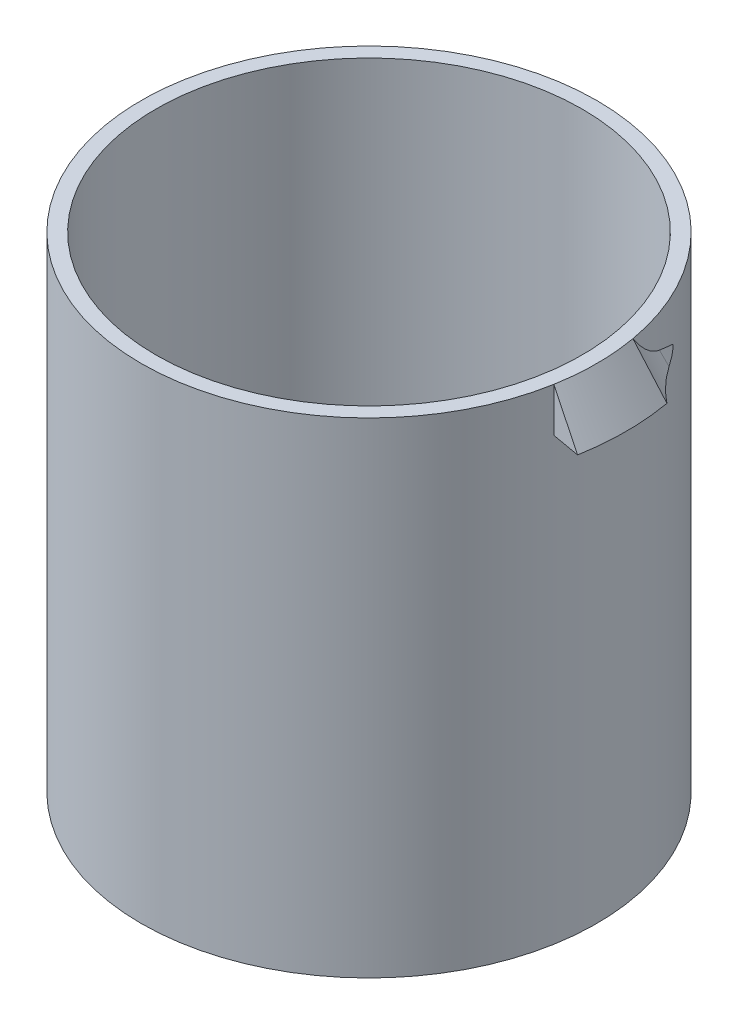
ISO-10303-21;
HEADER;
FILE_DESCRIPTION(('STEP AP214'),'2;1');
FILE_NAME('part.step','',(''),(''),'','','');
FILE_SCHEMA(('AUTOMOTIVE_DESIGN { 1 0 10303 214 1 1 1 1 }'));
ENDSEC;
DATA;
#1=APPLICATION_CONTEXT('core data for automotive mechanical design processes');
#2=APPLICATION_PROTOCOL_DEFINITION('international standard','automotive_design',2000,#1);
#3=PRODUCT_CONTEXT('',#1,'mechanical');
#4=PRODUCT('Part','Part','',(#3));
#5=PRODUCT_RELATED_PRODUCT_CATEGORY('part','',(#4));
#6=PRODUCT_DEFINITION_FORMATION('','',#4);
#7=PRODUCT_DEFINITION_CONTEXT('part definition',#1,'design');
#8=PRODUCT_DEFINITION('design','',#6,#7);
#9=PRODUCT_DEFINITION_SHAPE('','',#8);
#10=(LENGTH_UNIT() NAMED_UNIT(*) SI_UNIT(.MILLI.,.METRE.));
#11=(NAMED_UNIT(*) PLANE_ANGLE_UNIT() SI_UNIT($,.RADIAN.));
#12=(NAMED_UNIT(*) SI_UNIT($,.STERADIAN.) SOLID_ANGLE_UNIT());
#13=UNCERTAINTY_MEASURE_WITH_UNIT(LENGTH_MEASURE(1.E-05),#10,'distance_accuracy_value','');
#14=(GEOMETRIC_REPRESENTATION_CONTEXT(3) GLOBAL_UNCERTAINTY_ASSIGNED_CONTEXT((#13)) GLOBAL_UNIT_ASSIGNED_CONTEXT((#10,
#11,#12)) REPRESENTATION_CONTEXT('',''));
#15=CARTESIAN_POINT('',(0.,0.,0.));
#16=DIRECTION('',(0.,0.,1.));
#17=DIRECTION('',(1.,0.,0.));
#18=AXIS2_PLACEMENT_3D('',#15,#16,#17);
#19=CARTESIAN_POINT('',(0.,15.9574468085106,0.));
#20=DIRECTION('',(0.,1.,0.));
#21=DIRECTION('',(0.,0.,1.));
#22=AXIS2_PLACEMENT_3D('',#19,#20,#21);
#23=CYLINDRICAL_SURFACE('',#22,15.5);
#24=CARTESIAN_POINT('',(0.,15.,0.));
#25=DIRECTION('',(0.,1.,0.));
#26=DIRECTION('',(0.,0.,1.));
#27=AXIS2_PLACEMENT_3D('',#24,#25,#26);
#28=CIRCLE('',#27,15.5);
#29=CARTESIAN_POINT('',(15.2645201716892,15.,-2.69154675383743));
#30=VERTEX_POINT('',#29);
#31=CARTESIAN_POINT('',(-15.2645201716892,15.,-2.69154675383743));
#32=VERTEX_POINT('',#31);
#33=EDGE_CURVE('E442',#30,#32,#28,.T.);
#34=ORIENTED_EDGE('',*,*,#33,.F.);
#35=CARTESIAN_POINT('',(24.5839026419329,0.805276550059512,-4.3348053268829));
#36=CARTESIAN_POINT('',(23.5891425381802,0.25266157124027,-5.62675817713788));
#37=CARTESIAN_POINT('',(22.9934394777612,1.44675937896466E-12,-7.22218073569157));
#38=CARTESIAN_POINT('',(24.2769857876834,1.27275386222138,-4.28068760464454));
#39=CARTESIAN_POINT('',(23.2866165030069,0.719898379757891,-5.56534293207516));
#40=CARTESIAN_POINT('',(22.690945932805,0.464212598699652,-7.15172872099032));
#41=CARTESIAN_POINT('',(23.9700812713324,1.74021238203745,-4.22657205791058));
#42=CARTESIAN_POINT('',(22.9841057642059,1.18706350654899,-5.50375701516144));
#43=CARTESIAN_POINT('',(22.3885065918936,0.928154575660881,-7.08095403475552));
#44=CARTESIAN_POINT('',(23.356303030611,2.6750825211749,-4.11834639389961));
#45=CARTESIAN_POINT('',(22.3792185920833,2.1210798516731,-5.38022020546846));
#46=CARTESIAN_POINT('',(21.783772944913,1.85540089645361,-6.93867985138268));
#47=CARTESIAN_POINT('',(23.0494293066005,3.14249413994803,-4.06423627668608));
#48=CARTESIAN_POINT('',(22.0768433224221,2.58792930071882,-5.31826965179291));
#49=CARTESIAN_POINT('',(21.4814786404114,2.31870523349013,-6.86718034658755));
#50=CARTESIAN_POINT('',(22.1287222161158,4.54485986209304,-3.90189077530404));
#51=CARTESIAN_POINT('',(21.1699428384618,3.98795446453285,-5.13180868016328));
#52=CARTESIAN_POINT('',(20.5747290895767,3.70773031055507,-6.6514422579235));
#53=CARTESIAN_POINT('',(21.5149539923078,5.47971474406976,-3.79366687754518));
#54=CARTESIAN_POINT('',(20.5655515209269,4.92074821541284,-5.0066704428032));
#55=CARTESIAN_POINT('',(19.9705561200653,4.63233455032105,-6.50599869578724));
#56=CARTESIAN_POINT('',(20.2876457809214,7.34907687231123,-3.57725932623271));
#57=CARTESIAN_POINT('',(19.357721233765,6.78429357087823,-4.75436404827054));
#58=CARTESIAN_POINT('',(18.7634033988711,6.47749705494555,-6.21106060373084));
#59=CARTESIAN_POINT('',(19.6741058339157,8.28358405677817,-3.46907567983315));
#60=CARTESIAN_POINT('',(18.754293729364,7.71502773396105,-4.62719925130176));
#61=CARTESIAN_POINT('',(18.1604238143571,7.39805477236277,-6.06156554417817));
#62=CARTESIAN_POINT('',(18.7542835188275,9.68460214219841,-3.30688618822539));
#63=CARTESIAN_POINT('',(17.8503445536166,9.10874905388352,-4.43451095525993));
#64=CARTESIAN_POINT('',(17.2576837783464,8.77420317166545,-5.83346706490166));
#65=CARTESIAN_POINT('',(18.4477714131028,10.1514629657255,-3.25283983407235));
#66=CARTESIAN_POINT('',(17.5493089028306,9.57279974571186,-4.36997588525145));
#67=CARTESIAN_POINT('',(16.9570724220439,9.23211702035665,-5.75679519975306));
#68=CARTESIAN_POINT('',(17.8349637863296,11.0848547240136,-3.14478531548832));
#69=CARTESIAN_POINT('',(16.9478078115435,10.4998157963571,-4.24018046544251));
#70=CARTESIAN_POINT('',(16.3566152294932,10.1460172060053,-5.60198791386874));
#71=CARTESIAN_POINT('',(17.5286682620019,11.5513856637694,-3.09077715047909));
#72=CARTESIAN_POINT('',(16.6473437366808,10.9627791150859,-4.17492067563381));
#73=CARTESIAN_POINT('',(16.0567693814669,10.6020035726909,-5.52385251580719));
#74=CARTESIAN_POINT('',(17.0518261868783,12.2776828628904,-3.00669702709779));
#75=CARTESIAN_POINT('',(16.1799000570955,11.6828431217376,-4.07262695369388));
#76=CARTESIAN_POINT('',(15.5905356163775,11.3103605991819,-5.40085903028082));
#77=CARTESIAN_POINT('',(16.8811746156574,12.537609083057,-2.97660655079126));
#78=CARTESIAN_POINT('',(16.0126935591449,11.9403757650744,-4.03588296744094));
#79=CARTESIAN_POINT('',(15.4237938479164,11.5635620044312,-5.35657230161823));
#80=CARTESIAN_POINT('',(16.6692459289057,12.8604061255815,-2.93923780533082));
#81=CARTESIAN_POINT('',(15.8051299424023,12.2600159881488,-3.99006269740401));
#82=CARTESIAN_POINT('',(15.2168861073194,11.8775813494158,-5.30121124831292));
#83=CARTESIAN_POINT('',(16.627913959818,12.9233604975814,-2.93194986401486));
#84=CARTESIAN_POINT('',(15.7646566206698,12.3223409936402,-3.98111827209071));
#85=CARTESIAN_POINT('',(15.1765411833738,11.9388036738752,-5.29039718135161));
#86=CARTESIAN_POINT('',(16.5865855670979,12.9863094222732,-2.92466255330898));
#87=CARTESIAN_POINT('',(15.724190846655,12.3846519244517,-3.97216549123414));
#88=CARTESIAN_POINT('',(15.1362078546879,11.9999999958666,-5.27956661502428));
#89=CARTESIAN_POINT('',(16.4573414128411,13.1831663527677,-2.90187332181465));
#90=CARTESIAN_POINT('',(15.5976650016672,12.5794986844545,-3.94416055981767));
#91=CARTESIAN_POINT('',(15.0100901558893,12.191376036296,-5.2456736274993));
#92=CARTESIAN_POINT('',(16.3281286021804,13.3799755425798,-2.87908961704201));
#93=CARTESIAN_POINT('',(15.4711991544895,12.7742124375685,-3.91608313293093));
#94=CARTESIAN_POINT('',(14.88406712744,12.382504460411,-5.21164178803885));
#95=CARTESIAN_POINT('',(15.8933383103675,14.0422219919243,-2.80242435764529));
#96=CARTESIAN_POINT('',(15.0458373521999,13.4289772269522,-3.82133078041692));
#97=CARTESIAN_POINT('',(14.4602669297459,13.0248778224271,-5.09659461770462));
#98=CARTESIAN_POINT('',(15.5879443485123,14.5073797258898,-2.74857516242477));
#99=CARTESIAN_POINT('',(14.7472848598577,13.88830068656,-3.75430161758986));
#100=CARTESIAN_POINT('',(14.1630194503969,13.474816200313,-5.01489973215111));
#101=CARTESIAN_POINT('',(15.0373127033434,15.3460687646663,-2.65148394694959));
#102=CARTESIAN_POINT('',(14.2095664877929,14.7150805067704,-3.63243975721278));
#103=CARTESIAN_POINT('',(13.628139071085,14.2832152731039,-4.86573212371346));
#104=CARTESIAN_POINT('',(14.7919564270443,15.7197807031873,-2.60822101555189));
#105=CARTESIAN_POINT('',(13.9701838443847,15.0829680996173,-3.57778027461497));
#106=CARTESIAN_POINT('',(13.3901834718473,14.6424062411466,-4.79859231046696));
#107=CARTESIAN_POINT('',(14.5468777343,16.0930698431154,-2.56500702962432));
#108=CARTESIAN_POINT('',(13.7312988812687,15.449892109167,-3.52277009687646));
#109=CARTESIAN_POINT('',(13.1529639367154,14.9999999952345,-4.73077768529671));
#110=CARTESIAN_POINT('',(14.5171936284437,16.1382828896701,-2.55977292086365));
#111=CARTESIAN_POINT('',(13.7023707935004,15.4943272599116,-3.51610664217302));
#112=CARTESIAN_POINT('',(13.1242349669347,15.0433099901349,-4.72256075346525));
#113=CARTESIAN_POINT('',(14.4875140595921,16.1834890257319,-2.55453961209932));
#114=CARTESIAN_POINT('',(13.6734509660195,15.5387470999791,-3.509437750981));
#115=CARTESIAN_POINT('',(13.095518161347,15.0865949208518,-4.71433328418909));
#116=CARTESIAN_POINT('',(14.4281639954726,16.273887477518,-2.54407459448828));
#117=CARTESIAN_POINT('',(13.6156286684724,15.6275548737089,-3.49608928944862));
#118=CARTESIAN_POINT('',(13.0381088781461,15.1731146545392,-4.69785727062919));
#119=CARTESIAN_POINT('',(14.3984935002049,16.3190797932421,-2.53884288564159));
#120=CARTESIAN_POINT('',(13.5867261962463,15.6719428108412,-3.48940971903632));
#121=CARTESIAN_POINT('',(13.0094164005332,15.216349457509,-4.68960872634516));
#122=CARTESIAN_POINT('',(14.3688275419419,16.364265198473,-2.53361197679126));
#123=CARTESIAN_POINT('',(13.5578319789439,15.7163154459155,-3.48272471196431));
#124=CARTESIAN_POINT('',(12.9807360871137,15.2595591962947,-4.68134964461612));
#125=(BOUNDED_SURFACE() B_SPLINE_SURFACE(3,2,((#35,#36,#37),(#38,#39,#40),(#41,#42,#43),(#44,
#45,#46),(#47,#48,#49),(#50,#51,#52),(#53,#54,#55),(#56,#57,#58),(#59,#60,#61),(#62,#63,#64),
(#65,#66,#67),(#68,#69,#70),(#71,#72,#73),(#74,#75,#76),(#77,#78,#79),(#80,#81,#82),(#83,#84,
#85),(#86,#87,#88),(#89,#90,#91),(#92,#93,#94),(#95,#96,#97),(#98,#99,#100),(#101,#102,#103),
(#104,#105,#106),(#107,#108,#109),(#110,#111,#112),(#113,#114,#115),(#116,#117,#118),(#119,#120,
#121),(#122,#123,#124)),.UNSPECIFIED.,.F.,.F.,.F.) B_SPLINE_SURFACE_WITH_KNOTS((4,2,2,2,2,2,2,2,
3,2,2,3,2,4),(3,3),(0.,1.68598756420841,3.37199295803731,6.74483351968631,10.118117143626,
11.8046040622545,13.4910648741072,14.4313998709351,14.6592465396934,15.3717933334677,
17.0576477437954,18.4147812533155,18.579166341285,18.7435514316122),(0.,1.),
.UNSPECIFIED.) GEOMETRIC_REPRESENTATION_ITEM() RATIONAL_B_SPLINE_SURFACE(((1.,0.985501166729328,
1.),(1.,0.985631977578393,1.),(1.,0.985763685986085,1.),(1.,0.986029060666847,1.),(1.,
0.986162726960607,1.),(1.,0.986566968927873,1.),(1.,0.986840723466707,1.),(1.,0.987398044005513,
1.),(1.,0.987681611289613,1.),(1.,0.988114790736675,1.),(1.,0.98826048176874,1.),(1.,
0.988554394826198,1.),(1.,0.988702616812376,1.),(1.,0.988935231885147,1.),(1.,0.98901885178262,
1.),(1.,0.989123101764831,1.),(1.,0.989143452507842,1.),(1.,0.989163819933603,1.),(1.,
0.989227684247275,1.),(1.,0.989291547133079,1.),(1.,0.98950633397411,1.),(1.,0.989657021855318,
1.),(1.,0.989927303221843,1.),(1.,0.990047230547602,1.),(1.,0.990166198291542,1.),(1.,
0.990180619555669,1.),(1.,0.990195026642998,1.),(1.,0.990223812464263,1.),(1.,0.9902381911982,
1.),(1.,0.990252555755337,1.))) REPRESENTATION_ITEM('') SURFACE());
#126=CARTESIAN_POINT('',(15.2645201716892,15.,-2.69154675383743));
#127=CARTESIAN_POINT('',(15.2457688188847,14.8462739957379,-2.79775326276628));
#128=CARTESIAN_POINT('',(15.2251802957685,14.6955084130414,-2.9081628345051));
#129=CARTESIAN_POINT('',(15.1794068401206,14.4012973308106,-3.13841327297706));
#130=CARTESIAN_POINT('',(15.1542067763685,14.2578779788383,-3.25828442588403));
#131=CARTESIAN_POINT('',(15.0992035888394,13.9847907568255,-3.50419871139809));
#132=CARTESIAN_POINT('',(15.0695534755999,13.8548462195323,-3.62996565717081));
#133=CARTESIAN_POINT('',(15.0042891872416,13.6067655473667,-3.89093771285995));
#134=CARTESIAN_POINT('',(14.9686834533136,13.4886130722349,-4.02612930878218));
#135=CARTESIAN_POINT('',(14.8875981067541,13.2586859841694,-4.31668558650818));
#136=CARTESIAN_POINT('',(14.8415833969721,13.1480272680428,-4.47280274406001));
#137=CARTESIAN_POINT('',(14.765407328259,12.9972673838808,-4.71594171526164));
#138=CARTESIAN_POINT('',(14.7385911984145,12.949246958486,-4.79914921229884));
#139=CARTESIAN_POINT('',(14.6825155693523,12.8592413476888,-4.96806515945238));
#140=CARTESIAN_POINT('',(14.6532539628718,12.8172614539608,-5.05377572421593));
#141=CARTESIAN_POINT('',(14.6227333365359,12.778610754586,-5.14059041050353));
#142=B_SPLINE_CURVE_WITH_KNOTS('',3,(#126,#127,#128,#129,#130,#131,#132,#133,#134,#135,#136,
#137,#138,#139,#140,#141),.UNSPECIFIED.,.F.,.F.,(4,2,2,2,2,2,2,4),(0.,0.563480863102572,
1.12884487578101,1.67796932857214,2.22632197513161,2.81518217780478,3.11419166684052,
3.41346152228456),.UNSPECIFIED.);
#143=CARTESIAN_POINT('',(14.6227333365359,12.778610754586,-5.14059041050352));
#144=VERTEX_POINT('',#143);
#145=EDGE_CURVE('E61',#30,#144,#142,.T.);
#146=ORIENTED_EDGE('',*,*,#145,.T.);
#147=CARTESIAN_POINT('',(13.9520483062786,12.,-6.75206250409966));
#148=CARTESIAN_POINT('',(13.9980866504598,12.0497294011142,-6.65693106606465));
#149=CARTESIAN_POINT('',(14.0432244646101,12.0991015494988,-6.56118020693241));
#150=CARTESIAN_POINT('',(14.1316703191563,12.1970809933232,-6.36844870978878));
#151=CARTESIAN_POINT('',(14.1749783415747,12.2456882812455,-6.27146805970695));
#152=CARTESIAN_POINT('',(14.3021193096459,12.390292689114,-5.9786840452533));
#153=CARTESIAN_POINT('',(14.3831626400687,12.4850653092462,-5.78105206686456));
#154=CARTESIAN_POINT('',(14.537445759664,12.6710762391885,-5.38131371336228));
#155=CARTESIAN_POINT('',(14.610690654696,12.7623168362961,-5.17921037179447));
#156=CARTESIAN_POINT('',(14.7491292204208,12.9411723567924,-4.77071309024729));
#157=CARTESIAN_POINT('',(14.8143234643245,13.028787538017,-4.56431945696309));
#158=CARTESIAN_POINT('',(14.9761295132252,13.2562101201124,-4.01174480441988));
#159=CARTESIAN_POINT('',(15.0655346187344,13.3928283586131,-3.66210474082838));
#160=CARTESIAN_POINT('',(15.2201968690921,13.6568642588077,-2.95412290402578));
#161=CARTESIAN_POINT('',(15.2854542942934,13.7842820273046,-2.59578123189123));
#162=CARTESIAN_POINT('',(15.3649244028111,13.9715645564151,-2.05031554270925));
#163=CARTESIAN_POINT('',(15.388478824446,14.0339289513745,-1.86535887345806));
#164=CARTESIAN_POINT('',(15.4289314637247,14.1573904506734,-1.49428740710848));
#165=CARTESIAN_POINT('',(15.4458296047468,14.2184875404169,-1.30817259670354));
#166=CARTESIAN_POINT('',(15.4728918107942,14.3399341562535,-0.935187834946152));
#167=CARTESIAN_POINT('',(15.4830550263117,14.4002835870991,-0.748317791322311));
#168=CARTESIAN_POINT('',(15.4966121640847,14.520800212703,-0.374277759897957));
#169=CARTESIAN_POINT('',(15.5000062220556,14.5809674110908,-0.187107778186231));
#170=CARTESIAN_POINT('',(15.5,14.6413312736564,0.));
#171=B_SPLINE_CURVE_WITH_KNOTS('',3,(#147,#148,#149,#150,#151,#152,#153,#154,#155,#156,#157,
#158,#159,#160,#161,#162,#163,#164,#165,#166,#167,#168,#169,#170),.UNSPECIFIED.,.F.,.F.,(4,2,2,
2,2,2,2,2,2,2,2,4),(0.,0.350392601029004,0.700788643843335,1.40163025947854,2.10201015511628,
2.80234015451694,3.95897958777173,5.11560559210242,5.70531674538739,6.29503468675867,
6.8848269978627,7.47460748404514),.UNSPECIFIED.);
#172=CARTESIAN_POINT('',(13.9533365428835,12.,-6.74940005464513));
#173=VERTEX_POINT('',#172);
#174=EDGE_CURVE('E108',#173,#144,#171,.T.);
#175=ORIENTED_EDGE('',*,*,#174,.F.);
#176=CARTESIAN_POINT('',(0.,12.,0.));
#177=DIRECTION('',(0.,-1.,0.));
#178=DIRECTION('',(0.,0.,1.));
#179=AXIS2_PLACEMENT_3D('',#176,#177,#178);
#180=CIRCLE('',#179,15.5);
#181=CARTESIAN_POINT('',(15.2645201716892,12.,2.69154675383743));
#182=VERTEX_POINT('',#181);
#183=EDGE_CURVE('E102',#173,#182,#180,.T.);
#184=ORIENTED_EDGE('',*,*,#183,.T.);
#185=DIRECTION('',(0.,1.,0.));
#186=VECTOR('',#185,1.);
#187=CARTESIAN_POINT('',(15.2645201716892,0.,2.69154675383743));
#188=LINE('',#187,#186);
#189=CARTESIAN_POINT('',(15.2645201716892,15.,2.69154675383743));
#190=VERTEX_POINT('',#189);
#191=EDGE_CURVE('E106',#182,#190,#188,.T.);
#192=ORIENTED_EDGE('',*,*,#191,.T.);
#193=CARTESIAN_POINT('',(-15.2645201716892,15.,2.69154675383743));
#194=VERTEX_POINT('',#193);
#195=EDGE_CURVE('E444',#194,#190,#28,.T.);
#196=ORIENTED_EDGE('',*,*,#195,.F.);
#197=CARTESIAN_POINT('',(-24.583902641933,0.805276550059492,4.3348053268829));
#198=CARTESIAN_POINT('',(-23.5891425381802,0.252661571240246,5.62675817713786));
#199=CARTESIAN_POINT('',(-22.9934394777612,1.45716771982052E-12,7.22218073569158));
#200=CARTESIAN_POINT('',(-24.2769887591474,1.27274933626598,4.28068812859381));
#201=CARTESIAN_POINT('',(-23.2866194315523,0.719893856896321,5.56534352659331));
#202=CARTESIAN_POINT('',(-22.6909488613836,0.46420810452475,7.15172940300319));
#203=CARTESIAN_POINT('',(-23.9700872165938,1.74020332657258,4.22657310622056));
#204=CARTESIAN_POINT('',(-22.9841116235596,1.1870544580596,5.50375820802549));
#205=CARTESIAN_POINT('',(-22.3885124506257,0.928145588406631,7.08095540574491));
#206=CARTESIAN_POINT('',(-23.3563149468628,2.6750643710561,4.11834849505631));
#207=CARTESIAN_POINT('',(-22.3792303339044,2.12106172189695,5.38022260732053));
#208=CARTESIAN_POINT('',(-21.7837846844793,1.85538290000266,6.9386826207182));
#209=CARTESIAN_POINT('',(-23.0494442200427,3.14247142468887,4.06423890632832));
#210=CARTESIAN_POINT('',(-22.0768580158628,2.58790661535196,5.31827266430676));
#211=CARTESIAN_POINT('',(-21.4814933306467,2.31868272097249,6.86718382534975));
#212=CARTESIAN_POINT('',(-22.1287463941815,4.54482303551601,3.90189503854937));
#213=CARTESIAN_POINT('',(-21.1699666488665,3.98791771210879,5.1318135926807));
#214=CARTESIAN_POINT('',(-20.5747528952903,3.70769386115057,6.65144795482107));
#215=CARTESIAN_POINT('',(-21.5149844284374,5.47966838558579,3.79367224425602));
#216=CARTESIAN_POINT('',(-20.5655814853315,4.92070197358462,5.00667665724734));
#217=CARTESIAN_POINT('',(-19.9705860756508,4.63228871873555,6.50600592657022));
#218=CARTESIAN_POINT('',(-20.2876765933359,7.34902994069275,3.57726475929273));
#219=CARTESIAN_POINT('',(-19.3577515452901,6.7842468137968,4.754370425088));
#220=CARTESIAN_POINT('',(-18.7634336857573,6.47745080447294,6.21106809192023));
#221=CARTESIAN_POINT('',(-19.6741307706966,8.28354607457175,3.46908007686044));
#222=CARTESIAN_POINT('',(-18.7543182477952,7.71498991838664,4.62720444717592));
#223=CARTESIAN_POINT('',(-18.1604483079639,7.39801740237265,6.06157167578681));
#224=CARTESIAN_POINT('',(-18.7542994093933,9.68457793864339,3.30688899016087));
#225=CARTESIAN_POINT('',(-17.8503601625354,9.1087249941768,4.43451429769078));
#226=CARTESIAN_POINT('',(-17.2576993639483,8.77417942855236,5.83347103146776));
#227=CARTESIAN_POINT('',(-18.447784216123,10.1514434649344,3.25284209159024));
#228=CARTESIAN_POINT('',(-17.5493214739977,9.57278037673189,4.3699785893763));
#229=CARTESIAN_POINT('',(-16.9570849693274,9.23209792016246,5.75679841438499));
#230=CARTESIAN_POINT('',(-17.8349704606233,11.0848445581304,3.14478649234638));
#231=CARTESIAN_POINT('',(-16.9478143600297,10.4998056986881,4.24018188708628));
#232=CARTESIAN_POINT('',(-16.3566217669465,10.1460072590951,5.60198961961862));
#233=CARTESIAN_POINT('',(-17.5286718952962,11.5513801297538,3.09077779112691));
#234=CARTESIAN_POINT('',(-16.6473473003382,10.9627735976743,4.17492145238731));
#235=CARTESIAN_POINT('',(-16.0567729480717,10.601998134467,5.52385346332194));
#236=CARTESIAN_POINT('',(-17.0234961594061,12.3208334586064,3.00170167889023));
#237=CARTESIAN_POINT('',(-16.1521353246067,11.7256127512211,4.06655101983119));
#238=CARTESIAN_POINT('',(-15.5628358380944,11.3524453642384,5.39355176395645));
#239=CARTESIAN_POINT('',(-16.8245313409528,12.6238847158362,2.96661881318515));
#240=CARTESIAN_POINT('',(-15.9572008096086,12.0258451270282,4.02368410481291));
#241=CARTESIAN_POINT('',(-15.3684514216396,11.647597210113,5.34186503494418));
#242=CARTESIAN_POINT('',(-16.6126272754045,12.9466442568229,2.92925440910718));
#243=CARTESIAN_POINT('',(-15.7496890428203,12.345388466096,3.97780580333214));
#244=CARTESIAN_POINT('',(-15.1616233549397,11.9614371280776,5.28638940777542));
#245=CARTESIAN_POINT('',(-16.5996062420152,12.9664771125496,2.92695844960393));
#246=CARTESIAN_POINT('',(-15.736939566393,12.36502089505,3.97498606200201));
#247=CARTESIAN_POINT('',(-15.1489150261954,11.9807198542289,5.28297883299726));
#248=CARTESIAN_POINT('',(-16.5865855657719,12.9863094242928,2.92466255307518));
#249=CARTESIAN_POINT('',(-15.7241908413266,12.384651923181,3.97216549177023));
#250=CARTESIAN_POINT('',(-15.1362078506913,11.9999999955935,5.27956662122391));
#251=CARTESIAN_POINT('',(-16.4936515415104,13.12786094637,2.90827577717205));
#252=CARTESIAN_POINT('',(-15.6331967083293,12.5247569663033,3.95204106058217));
#253=CARTESIAN_POINT('',(-15.0455026048987,12.137608335044,5.25522706088737));
#254=CARTESIAN_POINT('',(-16.4007363534715,13.2693837782445,2.8918923226032));
#255=CARTESIAN_POINT('',(-15.5422504584027,12.6647932898927,3.93186538117966));
#256=CARTESIAN_POINT('',(-14.9548700238761,12.2750871307065,5.23078197394701));
#257=CARTESIAN_POINT('',(-16.2149445613545,13.552370673223,2.85913221685878));
#258=CARTESIAN_POINT('',(-15.3604490028012,12.9446995010356,3.89142776343797));
#259=CARTESIAN_POINT('',(-14.7737321182441,12.5497635510331,5.18171809693912));
#260=CARTESIAN_POINT('',(-16.1220679581222,13.6938347350383,2.84275556583238));
#261=CARTESIAN_POINT('',(-15.2695938165008,13.0845693606543,3.87116583709224));
#262=CARTESIAN_POINT('',(-14.6832267963309,12.6869611697672,5.15709930325586));
#263=CARTESIAN_POINT('',(-15.7236850322104,14.3006276720759,2.77250990734055));
#264=CARTESIAN_POINT('',(-14.8800067105302,13.6841973085407,3.78409124659194));
#265=CARTESIAN_POINT('',(-14.2951668603394,13.2749283017795,5.05118499231613));
#266=CARTESIAN_POINT('',(-15.4183918292841,14.7656319360947,2.71867847863774));
#267=CARTESIAN_POINT('',(-14.5816324111514,14.1430977633067,3.716920001138));
#268=CARTESIAN_POINT('',(-13.9981672982468,13.7241795939094,4.96922454011829));
#269=CARTESIAN_POINT('',(-14.9244505256544,15.5179736527175,2.6315832999215));
#270=CARTESIAN_POINT('',(-14.0994390492961,14.8842925396148,3.60728620597934));
#271=CARTESIAN_POINT('',(-13.5186834982034,14.448380168865,4.83484063264777));
#272=CARTESIAN_POINT('',(-14.7355793737626,15.8056508434901,2.5982802199655));
#273=CARTESIAN_POINT('',(-13.9152081774822,15.1673799066648,3.56514184755761));
#274=CARTESIAN_POINT('',(-13.3355872810497,14.7246666181616,4.783033246285));
#275=CARTESIAN_POINT('',(-14.546877732981,16.0930698451244,2.56500702939174));
#276=CARTESIAN_POINT('',(-13.7312988777675,15.4498921092145,3.52277009672606));
#277=CARTESIAN_POINT('',(-13.1529639339639,14.9999999957655,4.7307776882681));
#278=CARTESIAN_POINT('',(-14.4890067917058,16.1812153858629,2.55480282104594));
#279=CARTESIAN_POINT('',(-13.674902100078,15.5365207256144,3.5097799083031));
#280=CARTESIAN_POINT('',(-13.0969541074259,15.0844369921331,4.7147590398938));
#281=CARTESIAN_POINT('',(-14.4311537582386,16.2693336505044,2.54460177032983));
#282=CARTESIAN_POINT('',(-13.6185378758239,15.6230893422704,3.49676877426222));
#283=CARTESIAN_POINT('',(-13.04099212829,15.1687762034719,4.69869977884382));
#284=CARTESIAN_POINT('',(-14.3154835004426,16.4455156374589,2.5242059830149));
#285=CARTESIAN_POINT('',(-13.5058776886408,15.7961017335004,3.47070534956497));
#286=CARTESIAN_POINT('',(-12.9291638585607,15.3372590655261,4.66650002958945));
#287=CARTESIAN_POINT('',(-14.257666276118,16.5335793597658,2.51401124641679));
#288=CARTESIAN_POINT('',(-13.4495817087749,15.8825455352141,3.45765305820466));
#289=CARTESIAN_POINT('',(-12.873297567978,15.4214027162197,4.65035954137596));
#290=CARTESIAN_POINT('',(-14.1998669596052,16.6216158059697,2.50381966744908));
#291=CARTESIAN_POINT('',(-13.3933182402614,15.9689294046382,3.44457981953617));
#292=CARTESIAN_POINT('',(-12.8174791248082,15.5054485818625,4.6341784404777));
#293=(BOUNDED_SURFACE() B_SPLINE_SURFACE(3,2,((#197,#198,#199),(#200,#201,#202),(#203,#204,
#205),(#206,#207,#208),(#209,#210,#211),(#212,#213,#214),(#215,#216,#217),(#218,#219,#220),
(#221,#222,#223),(#224,#225,#226),(#227,#228,#229),(#230,#231,#232),(#233,#234,#235),(#236,#237,
#238),(#239,#240,#241),(#242,#243,#244),(#245,#246,#247),(#248,#249,#250),(#251,#252,#253),
(#254,#255,#256),(#257,#258,#259),(#260,#261,#262),(#263,#264,#265),(#266,#267,#268),(#269,#270,
#271),(#272,#273,#274),(#275,#276,#277),(#278,#279,#280),(#281,#282,#283),(#284,#285,#286),
(#287,#288,#289),(#290,#291,#292)),.UNSPECIFIED.,.F.,.F.,.F.) B_SPLINE_SURFACE_WITH_KNOTS((4,2,
2,2,2,2,2,2,3,2,2,2,3,2,4),(3,3),(0.,1.68597123166155,3.37196016025101,6.7447662401135,
10.118082395959,11.8045859478475,13.4910648738052,14.5874612001087,14.6592452247923,
15.1715944946067,15.6839544607133,17.3698137486637,18.414787268212,18.7352619250308,
19.0557366177405),(0.,1.),
.UNSPECIFIED.) GEOMETRIC_REPRESENTATION_ITEM() RATIONAL_B_SPLINE_SURFACE(((1.,0.985501166729327,
1.),(1.,0.985631976313535,1.),(1.,0.985763683435466,1.),(1.,0.986029055494801,1.),(1.,
0.986162720452741,1.),(1.,0.986566958232368,1.),(1.,0.986840709859269,1.),(1.,0.987398029800956,
1.),(1.,0.987681599594078,1.),(1.,0.98811478322883,1.),(1.,0.988260475743768,1.),(1.,
0.988554391509616,1.),(1.,0.988702614723542,1.),(1.,0.988949052162001,1.),(1.,0.989046618083969,
1.),(1.,0.989150987937971,1.),(1.,0.989157403080511,1.),(1.,0.989163819873231,1.),(1.,
0.989209498465996,1.),(1.,0.989255441905803,1.),(1.,0.989347472630449,1.),(1.,0.989393559918272,
1.),(1.,0.989590768618024,1.),(1.,0.989740691461418,1.),(1.,0.989982202716484,1.),(1.,
0.990074300799256,1.),(1.,0.990166198261253,1.),(1.,0.990194316715603,1.),(1.,0.990222377667205,
1.),(1.,0.990278384568049,1.),(1.,0.990306330517279,1.),(1.,0.990334218963747,1.))) REPRESENTATION_ITEM('') SURFACE());
#294=CARTESIAN_POINT('',(-15.2645201716892,15.,2.69154675383743));
#295=CARTESIAN_POINT('',(-15.245768586033,14.8462741689708,2.79775469072923));
#296=CARTESIAN_POINT('',(-15.2251799541862,14.695508340001,2.90816466611282));
#297=CARTESIAN_POINT('',(-15.1794067103753,14.4012962920944,3.13841381098249));
#298=CARTESIAN_POINT('',(-15.1542069929193,14.2578761737735,3.25828321225862));
#299=CARTESIAN_POINT('',(-15.0992048578006,13.9847853825068,3.50419327589671));
#300=CARTESIAN_POINT('',(-15.0695554289691,13.8548381115349,3.62995779743417));
#301=CARTESIAN_POINT('',(-15.004290541788,13.6067603455416,3.8909323451129));
#302=CARTESIAN_POINT('',(-14.9686835109696,13.4886135295883,4.0261288735507));
#303=CARTESIAN_POINT('',(-14.8875980824666,13.2586855997287,4.31668591905782));
#304=CARTESIAN_POINT('',(-14.8415847846985,13.1480194305357,4.47279821274968));
#305=CARTESIAN_POINT('',(-14.7654093741946,12.9972560491102,4.71593523677255));
#306=CARTESIAN_POINT('',(-14.7385932392102,12.9492358017627,4.79914292818236));
#307=CARTESIAN_POINT('',(-14.6825170081322,12.8592334093948,4.96806096231578));
#308=CARTESIAN_POINT('',(-14.6532547934788,12.8172565860759,5.05377343176802));
#309=CARTESIAN_POINT('',(-14.6227333365359,12.778610754586,5.14059041050352));
#310=B_SPLINE_CURVE_WITH_KNOTS('',3,(#294,#295,#296,#297,#298,#299,#300,#301,#302,#303,#304,
#305,#306,#307,#308,#309),.UNSPECIFIED.,.F.,.F.,(4,2,2,2,2,2,2,4),(0.,0.563482542242906,
1.12884516949049,1.67796931248137,2.22632314052853,2.81518408424316,3.11419345549013,
3.41346453790825),.UNSPECIFIED.);
#311=CARTESIAN_POINT('',(-14.6227333365359,12.778610754586,5.14059041050352));
#312=VERTEX_POINT('',#311);
#313=EDGE_CURVE('E290',#194,#312,#310,.T.);
#314=ORIENTED_EDGE('',*,*,#313,.T.);
#315=CARTESIAN_POINT('',(-13.9520483062786,12.,6.75206250409966));
#316=CARTESIAN_POINT('',(-13.9980866504598,12.0497294011142,6.65693106606465));
#317=CARTESIAN_POINT('',(-14.0432244646101,12.0991015494988,6.56118020693241));
#318=CARTESIAN_POINT('',(-14.1316703191563,12.1970809933232,6.36844870978878));
#319=CARTESIAN_POINT('',(-14.1749783415747,12.2456882812455,6.27146805970695));
#320=CARTESIAN_POINT('',(-14.3021193096459,12.390292689114,5.9786840452533));
#321=CARTESIAN_POINT('',(-14.3831626400687,12.4850653092462,5.78105206686456));
#322=CARTESIAN_POINT('',(-14.537445759664,12.6710762391885,5.38131371336228));
#323=CARTESIAN_POINT('',(-14.610690654696,12.7623168362961,5.17921037179447));
#324=CARTESIAN_POINT('',(-14.7491292204208,12.9411723567924,4.77071309024729));
#325=CARTESIAN_POINT('',(-14.8143234643245,13.028787538017,4.56431945696309));
#326=CARTESIAN_POINT('',(-14.9761295132252,13.2562101201124,4.01174480441988));
#327=CARTESIAN_POINT('',(-15.0655346187344,13.3928283586131,3.66210474082838));
#328=CARTESIAN_POINT('',(-15.2201968690921,13.6568642588077,2.95412290402578));
#329=CARTESIAN_POINT('',(-15.2854542942934,13.7842820273046,2.59578123189123));
#330=CARTESIAN_POINT('',(-15.3649244028111,13.9715645564151,2.05031554270925));
#331=CARTESIAN_POINT('',(-15.388478824446,14.0339289513745,1.86535887345806));
#332=CARTESIAN_POINT('',(-15.4289314637247,14.1573904506734,1.49428740710848));
#333=CARTESIAN_POINT('',(-15.4458296047468,14.2184875404169,1.30817259670354));
#334=CARTESIAN_POINT('',(-15.4728918107942,14.3399341562535,0.935187834946152));
#335=CARTESIAN_POINT('',(-15.4830550263117,14.4002835870991,0.748317791322311));
#336=CARTESIAN_POINT('',(-15.4966121640847,14.520800212703,0.374277759897957));
#337=CARTESIAN_POINT('',(-15.5000062220556,14.5809674110908,0.187107778186231));
#338=CARTESIAN_POINT('',(-15.5,14.6413312736564,0.));
#339=B_SPLINE_CURVE_WITH_KNOTS('',3,(#315,#316,#317,#318,#319,#320,#321,#322,#323,#324,#325,
#326,#327,#328,#329,#330,#331,#332,#333,#334,#335,#336,#337,#338),.UNSPECIFIED.,.F.,.F.,(4,2,2,
2,2,2,2,2,2,2,2,4),(0.,0.350392601029004,0.700788643843335,1.40163025947854,2.10201015511628,
2.80234015451694,3.95897958777173,5.11560559210242,5.70531674538739,6.29503468675867,
6.8848269978627,7.47460748404514),.UNSPECIFIED.);
#340=CARTESIAN_POINT('',(-13.9533365428835,12.,6.74940005464513));
#341=VERTEX_POINT('',#340);
#342=EDGE_CURVE('E125',#341,#312,#339,.T.);
#343=ORIENTED_EDGE('',*,*,#342,.F.);
#344=CARTESIAN_POINT('',(0.,12.,0.));
#345=DIRECTION('',(0.,1.,0.));
#346=DIRECTION('',(0.,0.,1.));
#347=AXIS2_PLACEMENT_3D('',#344,#345,#346);
#348=CIRCLE('',#347,15.5);
#349=CARTESIAN_POINT('',(-15.2645201716892,12.,-2.69154675383743));
#350=VERTEX_POINT('',#349);
#351=EDGE_CURVE('E465',#350,#341,#348,.T.);
#352=ORIENTED_EDGE('',*,*,#351,.F.);
#353=DIRECTION('',(0.,1.,0.));
#354=VECTOR('',#353,1.);
#355=CARTESIAN_POINT('',(-15.2645201716892,0.,-2.69154675383743));
#356=LINE('',#355,#354);
#357=EDGE_CURVE('E490',#350,#32,#356,.T.);
#358=ORIENTED_EDGE('',*,*,#357,.T.);
#359=EDGE_LOOP('',(#34,#146,#175,#184,#192,#196,#314,#343,#352,#358));
#360=FACE_BOUND('',#359,.T.);
#361=CARTESIAN_POINT('',(0.,-18.,0.));
#362=DIRECTION('',(0.,1.,0.));
#363=DIRECTION('',(0.,0.,1.));
#364=AXIS2_PLACEMENT_3D('',#361,#362,#363);
#365=CIRCLE('',#364,15.5);
#366=CARTESIAN_POINT('',(0.,-18.,15.5));
#367=VERTEX_POINT('',#366);
#368=EDGE_CURVE('E450',#367,#367,#365,.T.);
#369=ORIENTED_EDGE('',*,*,#368,.T.);
#370=EDGE_LOOP('',(#369));
#371=FACE_BOUND('',#370,.T.);
#372=ADVANCED_FACE('F36',(#360,#371),#23,.T.);
#373=CARTESIAN_POINT('',(0.,15.9574468085106,0.));
#374=DIRECTION('',(0.,1.,0.));
#375=DIRECTION('',(0.,0.,1.));
#376=AXIS2_PLACEMENT_3D('',#373,#374,#375);
#377=CYLINDRICAL_SURFACE('',#376,14.5);
#378=CARTESIAN_POINT('',(0.,15.,0.));
#379=DIRECTION('',(0.,1.,0.));
#380=DIRECTION('',(0.,0.,1.));
#381=AXIS2_PLACEMENT_3D('',#378,#379,#380);
#382=CIRCLE('',#381,14.5);
#383=CARTESIAN_POINT('',(0.,15.,14.5));
#384=VERTEX_POINT('',#383);
#385=EDGE_CURVE('E449',#384,#384,#382,.T.);
#386=ORIENTED_EDGE('',*,*,#385,.T.);
#387=EDGE_LOOP('',(#386));
#388=FACE_BOUND('',#387,.T.);
#389=CARTESIAN_POINT('',(0.,-12.,0.));
#390=DIRECTION('',(0.,-1.,0.));
#391=DIRECTION('',(0.,0.,-1.));
#392=AXIS2_PLACEMENT_3D('',#389,#390,#391);
#393=CIRCLE('',#392,14.5);
#394=CARTESIAN_POINT('',(0.,-12.,-14.5));
#395=VERTEX_POINT('',#394);
#396=EDGE_CURVE('E459',#395,#395,#393,.T.);
#397=ORIENTED_EDGE('',*,*,#396,.T.);
#398=EDGE_LOOP('',(#397));
#399=FACE_BOUND('',#398,.T.);
#400=ADVANCED_FACE('F300',(#388,#399),#377,.F.);
#401=CARTESIAN_POINT('',(0.,15.,0.));
#402=DIRECTION('',(0.,-1.,0.));
#403=DIRECTION('',(0.,0.,-1.));
#404=AXIS2_PLACEMENT_3D('',#401,#402,#403);
#405=PLANE('',#404);
#406=ORIENTED_EDGE('',*,*,#385,.F.);
#407=EDGE_LOOP('',(#406));
#408=FACE_BOUND('',#407,.T.);
#409=EDGE_CURVE('E446',#32,#194,#28,.T.);
#410=ORIENTED_EDGE('',*,*,#409,.T.);
#411=ORIENTED_EDGE('',*,*,#195,.T.);
#412=CARTESIAN_POINT('',(0.,15.,0.));
#413=DIRECTION('',(0.,-1.,0.));
#414=DIRECTION('',(0.,0.,1.));
#415=AXIS2_PLACEMENT_3D('',#412,#413,#414);
#416=CIRCLE('',#415,15.5);
#417=EDGE_CURVE('E112',#30,#190,#416,.T.);
#418=ORIENTED_EDGE('',*,*,#417,.F.);
#419=ORIENTED_EDGE('',*,*,#33,.T.);
#420=EDGE_LOOP('',(#410,#411,#418,#419));
#421=FACE_BOUND('',#420,.T.);
#422=ADVANCED_FACE('F302',(#408,#421),#405,.F.);
#423=CARTESIAN_POINT('',(0.,-18.,0.));
#424=DIRECTION('',(0.,-1.,0.));
#425=DIRECTION('',(0.,0.,-1.));
#426=AXIS2_PLACEMENT_3D('',#423,#424,#425);
#427=PLANE('',#426);
#428=ORIENTED_EDGE('',*,*,#368,.F.);
#429=EDGE_LOOP('',(#428));
#430=FACE_BOUND('',#429,.T.);
#431=ADVANCED_FACE('F305',(#430),#427,.T.);
#432=CARTESIAN_POINT('',(0.,-15.,0.));
#433=DIRECTION('',(0.,-1.,0.));
#434=DIRECTION('',(0.,0.,-1.));
#435=AXIS2_PLACEMENT_3D('',#432,#433,#434);
#436=PLANE('',#435);
#437=CARTESIAN_POINT('',(0.,-15.,0.));
#438=DIRECTION('',(0.,-1.,0.));
#439=DIRECTION('',(0.,0.,-1.));
#440=AXIS2_PLACEMENT_3D('',#437,#438,#439);
#441=CIRCLE('',#440,11.5);
#442=CARTESIAN_POINT('',(0.,-15.,-11.5));
#443=VERTEX_POINT('',#442);
#444=EDGE_CURVE('E456',#443,#443,#441,.F.);
#445=ORIENTED_EDGE('',*,*,#444,.T.);
#446=EDGE_LOOP('',(#445));
#447=FACE_BOUND('',#446,.T.);
#448=ADVANCED_FACE('F310',(#447),#436,.F.);
#449=CARTESIAN_POINT('',(0.,12.,0.));
#450=DIRECTION('',(0.,-1.,0.));
#451=DIRECTION('',(0.,0.,-1.));
#452=AXIS2_PLACEMENT_3D('',#449,#450,#451);
#453=PLANE('',#452);
#454=ORIENTED_EDGE('',*,*,#351,.T.);
#455=CARTESIAN_POINT('',(-17.2341356777136,12.,0.));
#456=CARTESIAN_POINT('',(-16.8376924936845,12.0000000000223,2.07390272831995));
#457=CARTESIAN_POINT('',(-16.1195974017144,12.,3.85590075972461));
#458=CARTESIAN_POINT('',(-14.048681465461,12.,6.85532354000306));
#459=CARTESIAN_POINT('',(-12.6959303136672,12.,8.07434066947229));
#460=CARTESIAN_POINT('',(-11.0165098539334,12.,9.02051945672332));
#461=B_SPLINE_CURVE_WITH_KNOTS('',3,(#455,#456,#457,#458,#459,#460),.UNSPECIFIED.,.F.,.F.,(4,2,
4),(0.,0.5,1.),.UNSPECIFIED.);
#462=CARTESIAN_POINT('',(-15.1357151133737,12.,5.27923193565538));
#463=VERTEX_POINT('',#462);
#464=EDGE_CURVE('E128',#463,#341,#461,.T.);
#465=ORIENTED_EDGE('',*,*,#464,.F.);
#466=CARTESIAN_POINT('',(-15.1362078524346,12.,5.27956661359925));
#467=CARTESIAN_POINT('',(-15.2808856597936,12.,5.06646359069202));
#468=CARTESIAN_POINT('',(-15.4343762942468,12.,4.85944074670746));
#469=CARTESIAN_POINT('',(-15.7563529704877,12.,4.45933104600986));
#470=CARTESIAN_POINT('',(-15.9247485667334,12.,4.26617149084294));
#471=CARTESIAN_POINT('',(-16.2755752553713,12.,3.89314028130817));
#472=CARTESIAN_POINT('',(-16.4580049006512,12.,3.71326726064664));
#473=CARTESIAN_POINT('',(-16.8364434039215,12.,3.36613905047325));
#474=CARTESIAN_POINT('',(-17.0325240978223,12.,3.19896208824577));
#475=CARTESIAN_POINT('',(-17.2341356777127,12.,3.03884310917064));
#476=B_SPLINE_CURVE_WITH_KNOTS('',3,(#466,#467,#468,#469,#470,#471,#472,#473,#474,#475),
.UNSPECIFIED.,.F.,.F.,(4,2,2,2,4),(0.,0.772386685242809,1.54037146705699,2.30827716446013,
3.08058407883262),.UNSPECIFIED.);
#477=CARTESIAN_POINT('',(-17.2341356777136,12.,3.03884310917129));
#478=VERTEX_POINT('',#477);
#479=EDGE_CURVE('E160',#463,#478,#476,.T.);
#480=ORIENTED_EDGE('',*,*,#479,.T.);
#481=CARTESIAN_POINT('',(0.,12.,0.));
#482=DIRECTION('',(0.,1.,0.));
#483=DIRECTION('',(0.,0.,1.));
#484=AXIS2_PLACEMENT_3D('',#481,#482,#483);
#485=CIRCLE('',#484,17.5);
#486=CARTESIAN_POINT('',(-17.2341356777136,12.,-3.03884310917129));
#487=VERTEX_POINT('',#486);
#488=EDGE_CURVE('E482',#487,#478,#485,.T.);
#489=ORIENTED_EDGE('',*,*,#488,.F.);
#490=DIRECTION('',(0.984807753012208,0.,0.173648177666931));
#491=VECTOR('',#490,1.);
#492=CARTESIAN_POINT('',(0.,12.,0.));
#493=LINE('',#492,#491);
#494=EDGE_CURVE('E480',#487,#350,#493,.T.);
#495=ORIENTED_EDGE('',*,*,#494,.T.);
#496=EDGE_LOOP('',(#454,#465,#480,#489,#495));
#497=FACE_BOUND('',#496,.T.);
#498=ADVANCED_FACE('F349',(#497),#453,.T.);
#499=CARTESIAN_POINT('',(0.,15.,0.));
#500=DIRECTION('',(0.,-1.,0.));
#501=DIRECTION('',(0.,0.,-1.));
#502=AXIS2_PLACEMENT_3D('',#499,#500,#501);
#503=CONICAL_SURFACE('',#502,15.5,0.588002603547568);
#504=DIRECTION('',(-0.546273053839999,-0.832050294337844,-0.0963226782259999));
#505=VECTOR('',#504,1.);
#506=CARTESIAN_POINT('',(-17.3856445627924,11.7692307692308,-3.06555821342774));
#507=LINE('',#506,#505);
#508=EDGE_CURVE('E488',#32,#487,#507,.T.);
#509=ORIENTED_EDGE('',*,*,#508,.T.);
#510=ORIENTED_EDGE('',*,*,#488,.T.);
#511=DIRECTION('',(-0.546273053839999,-0.832050294337844,0.0963226782259999));
#512=VECTOR('',#511,1.);
#513=CARTESIAN_POINT('',(-17.3856445627924,11.7692307692308,3.06555821342774));
#514=LINE('',#513,#512);
#515=EDGE_CURVE('E111',#194,#478,#514,.T.);
#516=ORIENTED_EDGE('',*,*,#515,.F.);
#517=ORIENTED_EDGE('',*,*,#409,.F.);
#518=EDGE_LOOP('',(#509,#510,#516,#517));
#519=FACE_BOUND('',#518,.T.);
#520=ADVANCED_FACE('F225',(#519),#503,.T.);
#521=CARTESIAN_POINT('',(0.,0.,0.));
#522=DIRECTION('',(-0.173648177666931,0.,0.984807753012208));
#523=DIRECTION('',(0.984807753012208,0.,0.173648177666931));
#524=AXIS2_PLACEMENT_3D('',#521,#522,#523);
#525=PLANE('',#524);
#526=ORIENTED_EDGE('',*,*,#494,.F.);
#527=ORIENTED_EDGE('',*,*,#508,.F.);
#528=ORIENTED_EDGE('',*,*,#357,.F.);
#529=EDGE_LOOP('',(#526,#527,#528));
#530=FACE_BOUND('',#529,.T.);
#531=ADVANCED_FACE('F212',(#530),#525,.F.);
#532=CARTESIAN_POINT('',(0.,-12.,0.));
#533=DIRECTION('',(0.,-1.,0.));
#534=DIRECTION('',(0.,0.,-1.));
#535=AXIS2_PLACEMENT_3D('',#532,#533,#534);
#536=TOROIDAL_SURFACE('',#535,11.5,3.);
#537=ORIENTED_EDGE('',*,*,#396,.F.);
#538=EDGE_LOOP('',(#537));
#539=FACE_BOUND('',#538,.T.);
#540=ORIENTED_EDGE('',*,*,#444,.F.);
#541=EDGE_LOOP('',(#540));
#542=FACE_BOUND('',#541,.T.);
#543=ADVANCED_FACE('F202',(#539,#542),#536,.F.);
#544=CARTESIAN_POINT('',(0.,12.,0.));
#545=DIRECTION('',(0.,-1.,0.));
#546=DIRECTION('',(0.,0.,-1.));
#547=AXIS2_PLACEMENT_3D('',#544,#545,#546);
#548=PLANE('',#547);
#549=DIRECTION('',(-0.984807753012208,0.,-0.173648177666931));
#550=VECTOR('',#549,1.);
#551=CARTESIAN_POINT('',(0.,12.,0.));
#552=LINE('',#551,#550);
#553=CARTESIAN_POINT('',(17.2341356777136,12.,3.03884310917129));
#554=VERTEX_POINT('',#553);
#555=EDGE_CURVE('E117',#554,#182,#552,.T.);
#556=ORIENTED_EDGE('',*,*,#555,.T.);
#557=ORIENTED_EDGE('',*,*,#183,.F.);
#558=CARTESIAN_POINT('',(17.2341356777136,12.,0.));
#559=CARTESIAN_POINT('',(16.8376924936845,12.0000000000223,-2.07390272831995));
#560=CARTESIAN_POINT('',(16.1195974017144,12.,-3.85590075972461));
#561=CARTESIAN_POINT('',(14.048681465461,12.,-6.85532354000306));
#562=CARTESIAN_POINT('',(12.6959303136672,12.,-8.07434066947229));
#563=CARTESIAN_POINT('',(11.0165098539334,12.,-9.02051945672332));
#564=B_SPLINE_CURVE_WITH_KNOTS('',3,(#558,#559,#560,#561,#562,#563),.UNSPECIFIED.,.F.,.F.,(4,2,
4),(0.,0.5,1.),.UNSPECIFIED.);
#565=CARTESIAN_POINT('',(15.1357151133737,12.,-5.27923193565537));
#566=VERTEX_POINT('',#565);
#567=EDGE_CURVE('E40',#566,#173,#564,.T.);
#568=ORIENTED_EDGE('',*,*,#567,.F.);
#569=CARTESIAN_POINT('',(15.1362078524346,12.,-5.27956661359925));
#570=CARTESIAN_POINT('',(15.2808856216133,12.,-5.06646355921704));
#571=CARTESIAN_POINT('',(15.4343762362433,12.,-4.85944069513229));
#572=CARTESIAN_POINT('',(15.7563528956615,12.,-4.45933097403958));
#573=CARTESIAN_POINT('',(15.9247484946279,12.,-4.26617141836155));
#574=CARTESIAN_POINT('',(16.2755751985813,12.,-3.89314022223544));
#575=CARTESIAN_POINT('',(16.4580048563289,12.,-3.71326721537369));
#576=CARTESIAN_POINT('',(16.8364433849435,12.,-3.36613903144363));
#577=CARTESIAN_POINT('',(17.0325240918268,12.,-3.19896208178445));
#578=CARTESIAN_POINT('',(17.2341356777127,12.,-3.03884310917064));
#579=B_SPLINE_CURVE_WITH_KNOTS('',3,(#569,#570,#571,#572,#573,#574,#575,#576,#577,#578),
.UNSPECIFIED.,.F.,.F.,(4,2,2,2,4),(0.,0.772386696535395,1.54037148264077,2.30827717746424,
3.08058409619855),.UNSPECIFIED.);
#580=CARTESIAN_POINT('',(17.2341356777136,12.,-3.03884310917129));
#581=VERTEX_POINT('',#580);
#582=EDGE_CURVE('E12',#566,#581,#579,.T.);
#583=ORIENTED_EDGE('',*,*,#582,.T.);
#584=CARTESIAN_POINT('',(0.,12.,0.));
#585=DIRECTION('',(0.,-1.,0.));
#586=DIRECTION('',(0.,0.,1.));
#587=AXIS2_PLACEMENT_3D('',#584,#585,#586);
#588=CIRCLE('',#587,17.5);
#589=EDGE_CURVE('E124',#581,#554,#588,.T.);
#590=ORIENTED_EDGE('',*,*,#589,.T.);
#591=EDGE_LOOP('',(#556,#557,#568,#583,#590));
#592=FACE_BOUND('',#591,.T.);
#593=ADVANCED_FACE('F122',(#592),#548,.T.);
#594=CARTESIAN_POINT('',(0.,15.,0.));
#595=DIRECTION('',(0.,-1.,0.));
#596=DIRECTION('',(0.,0.,-1.));
#597=AXIS2_PLACEMENT_3D('',#594,#595,#596);
#598=CONICAL_SURFACE('',#597,15.5,0.588002603547568);
#599=DIRECTION('',(0.546273053839999,-0.832050294337844,-0.0963226782259999));
#600=VECTOR('',#599,1.);
#601=CARTESIAN_POINT('',(17.3856445627924,11.7692307692308,-3.06555821342774));
#602=LINE('',#601,#600);
#603=EDGE_CURVE('E140',#30,#581,#602,.T.);
#604=ORIENTED_EDGE('',*,*,#603,.F.);
#605=ORIENTED_EDGE('',*,*,#417,.T.);
#606=DIRECTION('',(0.546273053839999,-0.832050294337844,0.0963226782259999));
#607=VECTOR('',#606,1.);
#608=CARTESIAN_POINT('',(17.3856445627924,11.7692307692308,3.06555821342774));
#609=LINE('',#608,#607);
#610=EDGE_CURVE('E119',#190,#554,#609,.T.);
#611=ORIENTED_EDGE('',*,*,#610,.T.);
#612=ORIENTED_EDGE('',*,*,#589,.F.);
#613=EDGE_LOOP('',(#604,#605,#611,#612));
#614=FACE_BOUND('',#613,.T.);
#615=ADVANCED_FACE('F201',(#614),#598,.T.);
#616=CARTESIAN_POINT('',(0.,0.,0.));
#617=DIRECTION('',(-0.173648177666931,0.,0.984807753012208));
#618=DIRECTION('',(-0.984807753012208,0.,-0.173648177666931));
#619=AXIS2_PLACEMENT_3D('',#616,#617,#618);
#620=PLANE('',#619);
#621=ORIENTED_EDGE('',*,*,#555,.F.);
#622=ORIENTED_EDGE('',*,*,#610,.F.);
#623=ORIENTED_EDGE('',*,*,#191,.F.);
#624=EDGE_LOOP('',(#621,#622,#623));
#625=FACE_BOUND('',#624,.T.);
#626=ADVANCED_FACE('F116',(#625),#620,.T.);
#627=CARTESIAN_POINT('',(-15.2645201716892,15.,0.));
#628=CARTESIAN_POINT('',(-14.8673632747857,15.0000000000223,1.84746841268887));
#629=CARTESIAN_POINT('',(-14.1942221878375,15.,3.34161351315192));
#630=CARTESIAN_POINT('',(-12.3675472135948,15.,5.78511388225788));
#631=CARTESIAN_POINT('',(-11.2145693171047,15.,6.74791343358569));
#632=CARTESIAN_POINT('',(-9.74347919943993,15.,7.51759624035734));
#633=CARTESIAN_POINT('',(-17.2341356777136,12.,0.));
#634=CARTESIAN_POINT('',(-16.8376924936845,12.0000000000223,2.07390272831995));
#635=CARTESIAN_POINT('',(-16.1195974017144,12.,3.85590075972461));
#636=CARTESIAN_POINT('',(-14.048681465461,12.,6.85532354000306));
#637=CARTESIAN_POINT('',(-12.6959303136672,12.,8.07434066947229));
#638=CARTESIAN_POINT('',(-11.0165098539334,12.,9.02051945672332));
#639=B_SPLINE_SURFACE_WITH_KNOTS('',1,3,((#627,#628,#629,#630,#631,#632),(#633,#634,#635,#636,
#637,#638)),.UNSPECIFIED.,.F.,.F.,.F.,(2,2),(4,2,4),(0.,1.),(0.,0.5,1.),.UNSPECIFIED.);
#640=CARTESIAN_POINT('',(-12.8174791248082,15.5054485818625,4.6341784404777));
#641=CARTESIAN_POINT('',(-12.873297567978,15.4214027162197,4.65035954137596));
#642=CARTESIAN_POINT('',(-12.9291638585607,15.3372590655261,4.66650002958945));
#643=CARTESIAN_POINT('',(-13.04099212829,15.1687762034719,4.69869977884382));
#644=CARTESIAN_POINT('',(-13.0969541074259,15.0844369921331,4.7147590398938));
#645=CARTESIAN_POINT('',(-13.1529639339639,14.9999999957655,4.7307776882681));
#646=CARTESIAN_POINT('',(-13.3355872810497,14.7246666181616,4.783033246285));
#647=CARTESIAN_POINT('',(-13.5186834982034,14.448380168865,4.83484063264777));
#648=CARTESIAN_POINT('',(-13.9981672982468,13.7241795939094,4.96922454011829));
#649=CARTESIAN_POINT('',(-14.2951668603394,13.2749283017795,5.05118499231613));
#650=CARTESIAN_POINT('',(-14.6832267963309,12.6869611697672,5.15709930325586));
#651=CARTESIAN_POINT('',(-14.7737321182441,12.5497635510331,5.18171809693912));
#652=CARTESIAN_POINT('',(-14.9548700238761,12.2750871307065,5.23078197394701));
#653=CARTESIAN_POINT('',(-15.0455026048987,12.137608335044,5.25522706088737));
#654=CARTESIAN_POINT('',(-15.1362078506913,11.9999999955935,5.27956662122391));
#655=CARTESIAN_POINT('',(-15.1489150261954,11.9807198542289,5.28297883299726));
#656=CARTESIAN_POINT('',(-15.1616233549397,11.9614371280776,5.28638940777542));
#657=CARTESIAN_POINT('',(-15.3684514216396,11.647597210113,5.34186503494418));
#658=CARTESIAN_POINT('',(-15.5628358380944,11.3524453642384,5.39355176395645));
#659=CARTESIAN_POINT('',(-16.0567729480717,10.601998134467,5.52385346332194));
#660=CARTESIAN_POINT('',(-16.3566217669465,10.1460072590951,5.60198961961862));
#661=CARTESIAN_POINT('',(-16.9570849693274,9.23209792016246,5.75679841438499));
#662=CARTESIAN_POINT('',(-17.2576993639483,8.77417942855236,5.83347103146776));
#663=CARTESIAN_POINT('',(-18.1604483079639,7.39801740237265,6.06157167578681));
#664=CARTESIAN_POINT('',(-18.7634336857573,6.47745080447294,6.21106809192023));
#665=CARTESIAN_POINT('',(-19.9705860756508,4.63228871873555,6.50600592657022));
#666=CARTESIAN_POINT('',(-20.5747528952903,3.70769386115057,6.65144795482107));
#667=CARTESIAN_POINT('',(-21.4814933306467,2.31868272097249,6.86718382534975));
#668=CARTESIAN_POINT('',(-21.7837846844793,1.85538290000266,6.9386826207182));
#669=CARTESIAN_POINT('',(-22.3885124506257,0.928145588406631,7.08095540574491));
#670=CARTESIAN_POINT('',(-22.6909488613836,0.464208104524749,7.15172940300319));
#671=CARTESIAN_POINT('',(-22.9934394777612,1.45716771982052E-12,7.22218073569158));
#672=B_SPLINE_CURVE_WITH_KNOTS('',3,(#640,#641,#642,#643,#644,#645,#646,#647,#648,#649,#650,
#651,#652,#653,#654,#655,#656,#657,#658,#659,#660,#661,#662,#663,#664,#665,#666,#667,#668,#669,
#670,#671),.UNSPECIFIED.,.F.,.F.,(4,2,3,2,2,2,3,2,2,2,2,2,2,2,4),(0.,0.320474692709662,
0.640949349528481,1.68592286907681,3.37178215702719,3.88414212313379,4.39649139294813,
4.46827541763179,5.56467174393529,7.251150669893,8.93765422178144,12.310970377627,
15.6837764574894,17.3697653860789,19.0557366177405),.UNSPECIFIED.);
#673=EDGE_CURVE('E288',#312,#463,#672,.T.);
#674=ORIENTED_EDGE('',*,*,#342,.T.);
#675=ORIENTED_EDGE('',*,*,#673,.T.);
#676=ORIENTED_EDGE('',*,*,#464,.T.);
#677=EDGE_LOOP('',(#674,#675,#676));
#678=FACE_BOUND('',#677,.T.);
#679=ADVANCED_FACE('F260',(#678),#639,.T.);
#680=ORIENTED_EDGE('',*,*,#313,.F.);
#681=ORIENTED_EDGE('',*,*,#515,.T.);
#682=ORIENTED_EDGE('',*,*,#479,.F.);
#683=ORIENTED_EDGE('',*,*,#673,.F.);
#684=EDGE_LOOP('',(#680,#681,#682,#683));
#685=FACE_BOUND('',#684,.T.);
#686=ADVANCED_FACE('F220',(#685),#293,.F.);
#687=CARTESIAN_POINT('',(15.2645201716892,15.,0.));
#688=CARTESIAN_POINT('',(14.8673632747857,15.0000000000223,-1.84746841268887));
#689=CARTESIAN_POINT('',(14.1942221878375,15.,-3.34161351315192));
#690=CARTESIAN_POINT('',(12.3675472135948,15.,-5.78511388225788));
#691=CARTESIAN_POINT('',(11.2145693171047,15.,-6.74791343358569));
#692=CARTESIAN_POINT('',(9.74347919943993,15.,-7.51759624035734));
#693=CARTESIAN_POINT('',(17.2341356777136,12.,0.));
#694=CARTESIAN_POINT('',(16.8376924936845,12.0000000000223,-2.07390272831995));
#695=CARTESIAN_POINT('',(16.1195974017144,12.,-3.85590075972461));
#696=CARTESIAN_POINT('',(14.048681465461,12.,-6.85532354000306));
#697=CARTESIAN_POINT('',(12.6959303136672,12.,-8.07434066947229));
#698=CARTESIAN_POINT('',(11.0165098539334,12.,-9.02051945672332));
#699=B_SPLINE_SURFACE_WITH_KNOTS('',1,3,((#687,#688,#689,#690,#691,#692),(#693,#694,#695,#696,
#697,#698)),.UNSPECIFIED.,.F.,.F.,.F.,(2,2),(4,2,4),(0.,1.),(0.,0.5,1.),.UNSPECIFIED.);
#700=CARTESIAN_POINT('',(12.9807360871137,15.2595591962947,-4.68134964461612));
#701=CARTESIAN_POINT('',(13.0094164005332,15.216349457509,-4.68960872634516));
#702=CARTESIAN_POINT('',(13.0381088781461,15.1731146545392,-4.69785727062919));
#703=CARTESIAN_POINT('',(13.095518161347,15.0865949208518,-4.71433328418909));
#704=CARTESIAN_POINT('',(13.1242349669347,15.0433099901349,-4.72256075346525));
#705=CARTESIAN_POINT('',(13.1529639367154,14.9999999952345,-4.73077768529671));
#706=CARTESIAN_POINT('',(13.3901834718473,14.6424062411466,-4.79859231046696));
#707=CARTESIAN_POINT('',(13.628139071085,14.2832152731039,-4.86573212371346));
#708=CARTESIAN_POINT('',(14.1630194503969,13.474816200313,-5.01489973215111));
#709=CARTESIAN_POINT('',(14.4602669297459,13.0248778224271,-5.09659461770462));
#710=CARTESIAN_POINT('',(14.88406712744,12.382504460411,-5.21164178803885));
#711=CARTESIAN_POINT('',(15.0100901558893,12.191376036296,-5.2456736274993));
#712=CARTESIAN_POINT('',(15.1362078546879,11.9999999958666,-5.27956661502428));
#713=CARTESIAN_POINT('',(15.1765411833738,11.9388036738752,-5.29039718135161));
#714=CARTESIAN_POINT('',(15.2168861073194,11.8775813494158,-5.30121124831292));
#715=CARTESIAN_POINT('',(15.4237938479164,11.5635620044312,-5.35657230161823));
#716=CARTESIAN_POINT('',(15.5905356163775,11.3103605991819,-5.40085903028082));
#717=CARTESIAN_POINT('',(16.0567693814669,10.6020035726909,-5.52385251580719));
#718=CARTESIAN_POINT('',(16.3566152294932,10.1460172060053,-5.60198791386874));
#719=CARTESIAN_POINT('',(16.9570724220439,9.23211702035665,-5.75679519975306));
#720=CARTESIAN_POINT('',(17.2576837783464,8.77420317166545,-5.83346706490167));
#721=CARTESIAN_POINT('',(18.1604238143571,7.39805477236277,-6.06156554417817));
#722=CARTESIAN_POINT('',(18.7634033988711,6.47749705494555,-6.21106060373084));
#723=CARTESIAN_POINT('',(19.9705561200653,4.63233455032105,-6.50599869578724));
#724=CARTESIAN_POINT('',(20.5747290895767,3.70773031055507,-6.6514422579235));
#725=CARTESIAN_POINT('',(21.4814786404114,2.31870523349013,-6.86718034658755));
#726=CARTESIAN_POINT('',(21.783772944913,1.85540089645361,-6.93867985138268));
#727=CARTESIAN_POINT('',(22.3885065918936,0.928154575660882,-7.08095403475552));
#728=CARTESIAN_POINT('',(22.690945932805,0.464212598699652,-7.15172872099032));
#729=CARTESIAN_POINT('',(22.9934394777612,1.44675937896466E-12,-7.22218073569157));
#730=B_SPLINE_CURVE_WITH_KNOTS('',3,(#700,#701,#702,#703,#704,#705,#706,#707,#708,#709,#710,
#711,#712,#713,#714,#715,#716,#717,#718,#719,#720,#721,#722,#723,#724,#725,#726,#727,#728,#729),
.UNSPECIFIED.,.F.,.F.,(4,2,3,2,2,3,2,2,2,2,2,2,2,4),(0.,0.164385090327193,0.328770178296724,
1.68590368781685,3.37175809814455,4.0843048919188,4.31215156067712,5.25248655750497,
6.93894736935768,8.62543428798618,11.9987179119259,15.3715584735749,17.0575638674038,
18.7435514316122),.UNSPECIFIED.);
#731=EDGE_CURVE('E46',#144,#566,#730,.T.);
#732=ORIENTED_EDGE('',*,*,#174,.T.);
#733=ORIENTED_EDGE('',*,*,#731,.T.);
#734=ORIENTED_EDGE('',*,*,#567,.T.);
#735=EDGE_LOOP('',(#732,#733,#734));
#736=FACE_BOUND('',#735,.T.);
#737=ADVANCED_FACE('F172',(#736),#699,.T.);
#738=ORIENTED_EDGE('',*,*,#582,.F.);
#739=ORIENTED_EDGE('',*,*,#731,.F.);
#740=ORIENTED_EDGE('',*,*,#145,.F.);
#741=ORIENTED_EDGE('',*,*,#603,.T.);
#742=EDGE_LOOP('',(#738,#739,#740,#741));
#743=FACE_BOUND('',#742,.T.);
#744=ADVANCED_FACE('F166',(#743),#125,.F.);
#745=CLOSED_SHELL('',(#372,#400,#422,#431,#448,#498,#520,#531,#543,#593,#615,#626,#679,#686,
#737,#744));
#746=MANIFOLD_SOLID_BREP('B2',#745);
#747=ADVANCED_BREP_SHAPE_REPRESENTATION('',(#18,#746),#14);
#748=SHAPE_DEFINITION_REPRESENTATION(#9,#747);
ENDSEC;
END-ISO-10303-21;
